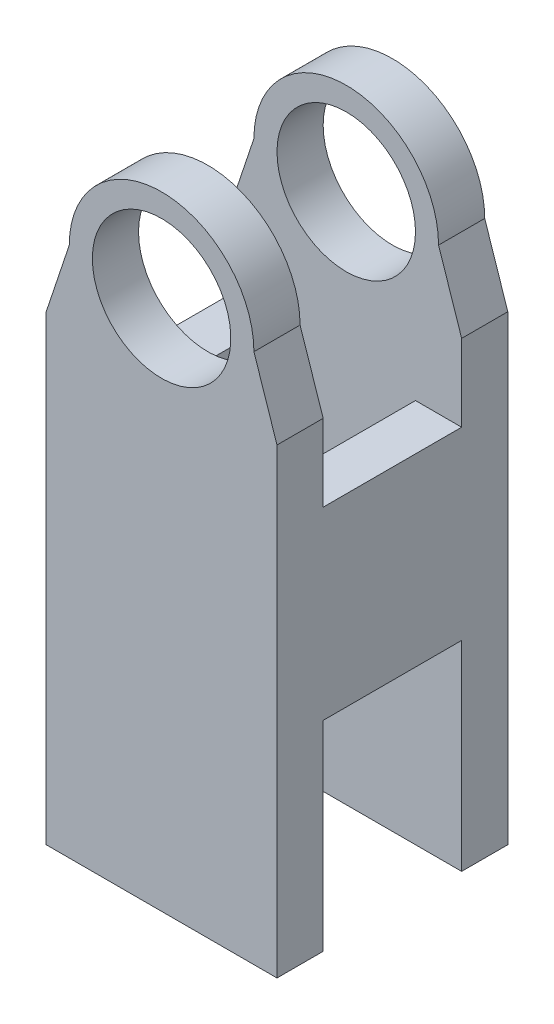
ISO-10303-21;
HEADER;
FILE_DESCRIPTION(('STEP AP214'),'2;1');
FILE_NAME('part.step','',(''),(''),'','','');
FILE_SCHEMA(('AUTOMOTIVE_DESIGN { 1 0 10303 214 1 1 1 1 }'));
ENDSEC;
DATA;
#1=APPLICATION_CONTEXT('core data for automotive mechanical design processes');
#2=APPLICATION_PROTOCOL_DEFINITION('international standard','automotive_design',2000,#1);
#3=PRODUCT_CONTEXT('',#1,'mechanical');
#4=PRODUCT('Part','Part','',(#3));
#5=PRODUCT_RELATED_PRODUCT_CATEGORY('part','',(#4));
#6=PRODUCT_DEFINITION_FORMATION('','',#4);
#7=PRODUCT_DEFINITION_CONTEXT('part definition',#1,'design');
#8=PRODUCT_DEFINITION('design','',#6,#7);
#9=PRODUCT_DEFINITION_SHAPE('','',#8);
#10=(LENGTH_UNIT() NAMED_UNIT(*) SI_UNIT(.MILLI.,.METRE.));
#11=(NAMED_UNIT(*) PLANE_ANGLE_UNIT() SI_UNIT($,.RADIAN.));
#12=(NAMED_UNIT(*) SI_UNIT($,.STERADIAN.) SOLID_ANGLE_UNIT());
#13=UNCERTAINTY_MEASURE_WITH_UNIT(LENGTH_MEASURE(1.E-05),#10,'distance_accuracy_value','');
#14=(GEOMETRIC_REPRESENTATION_CONTEXT(3) GLOBAL_UNCERTAINTY_ASSIGNED_CONTEXT((#13)) GLOBAL_UNIT_ASSIGNED_CONTEXT((#10,
#11,#12)) REPRESENTATION_CONTEXT('',''));
#15=CARTESIAN_POINT('',(0.,0.,0.));
#16=DIRECTION('',(0.,0.,1.));
#17=DIRECTION('',(1.,0.,0.));
#18=AXIS2_PLACEMENT_3D('',#15,#16,#17);
#19=CARTESIAN_POINT('',(7.5,30.,7.5));
#20=DIRECTION('',(-1.,0.,0.));
#21=DIRECTION('',(0.,0.,1.));
#22=AXIS2_PLACEMENT_3D('',#19,#20,#21);
#23=PLANE('',#22);
#24=DIRECTION('',(0.,1.,0.));
#25=VECTOR('',#24,1.);
#26=CARTESIAN_POINT('',(7.5,30.,-4.5));
#27=LINE('',#26,#25);
#28=CARTESIAN_POINT('',(7.5,25.,-4.5));
#29=VERTEX_POINT('',#28);
#30=CARTESIAN_POINT('',(7.5,30.,-4.5));
#31=VERTEX_POINT('',#30);
#32=EDGE_CURVE('E434',#29,#31,#27,.T.);
#33=ORIENTED_EDGE('',*,*,#32,.F.);
#34=DIRECTION('',(0.,0.,-1.));
#35=VECTOR('',#34,1.);
#36=CARTESIAN_POINT('',(7.5,25.,-4.5));
#37=LINE('',#36,#35);
#38=CARTESIAN_POINT('',(7.5,25.,4.5));
#39=VERTEX_POINT('',#38);
#40=EDGE_CURVE('E196',#39,#29,#37,.T.);
#41=ORIENTED_EDGE('',*,*,#40,.F.);
#42=DIRECTION('',(0.,-1.,0.));
#43=VECTOR('',#42,1.);
#44=CARTESIAN_POINT('',(7.5,30.,4.5));
#45=LINE('',#44,#43);
#46=CARTESIAN_POINT('',(7.5,30.,4.5));
#47=VERTEX_POINT('',#46);
#48=EDGE_CURVE('E80',#47,#39,#45,.T.);
#49=ORIENTED_EDGE('',*,*,#48,.F.);
#50=DIRECTION('',(0.,0.,-1.));
#51=VECTOR('',#50,1.);
#52=CARTESIAN_POINT('',(7.5,30.,7.5));
#53=LINE('',#52,#51);
#54=CARTESIAN_POINT('',(7.5,30.,7.5));
#55=VERTEX_POINT('',#54);
#56=EDGE_CURVE('E212',#55,#47,#53,.T.);
#57=ORIENTED_EDGE('',*,*,#56,.F.);
#58=DIRECTION('',(0.,-1.,0.));
#59=VECTOR('',#58,1.);
#60=CARTESIAN_POINT('',(7.5,30.,7.5));
#61=LINE('',#60,#59);
#62=CARTESIAN_POINT('',(7.5,0.,7.5));
#63=VERTEX_POINT('',#62);
#64=EDGE_CURVE('E238',#55,#63,#61,.T.);
#65=ORIENTED_EDGE('',*,*,#64,.T.);
#66=DIRECTION('',(0.,0.,-1.));
#67=VECTOR('',#66,1.);
#68=CARTESIAN_POINT('',(7.5,0.,7.5));
#69=LINE('',#68,#67);
#70=CARTESIAN_POINT('',(7.5,0.,4.5));
#71=VERTEX_POINT('',#70);
#72=EDGE_CURVE('E222',#63,#71,#69,.T.);
#73=ORIENTED_EDGE('',*,*,#72,.T.);
#74=DIRECTION('',(0.,-1.,0.));
#75=VECTOR('',#74,1.);
#76=CARTESIAN_POINT('',(7.5,0.,4.5));
#77=LINE('',#76,#75);
#78=CARTESIAN_POINT('',(7.5,13.,4.5));
#79=VERTEX_POINT('',#78);
#80=EDGE_CURVE('E273',#79,#71,#77,.T.);
#81=ORIENTED_EDGE('',*,*,#80,.F.);
#82=DIRECTION('',(0.,0.,1.));
#83=VECTOR('',#82,1.);
#84=CARTESIAN_POINT('',(7.5,13.,4.5));
#85=LINE('',#84,#83);
#86=CARTESIAN_POINT('',(7.5,13.,-4.5));
#87=VERTEX_POINT('',#86);
#88=EDGE_CURVE('E271',#87,#79,#85,.T.);
#89=ORIENTED_EDGE('',*,*,#88,.F.);
#90=DIRECTION('',(0.,1.,0.));
#91=VECTOR('',#90,1.);
#92=CARTESIAN_POINT('',(7.5,0.,-4.5));
#93=LINE('',#92,#91);
#94=CARTESIAN_POINT('',(7.5,0.,-4.5));
#95=VERTEX_POINT('',#94);
#96=EDGE_CURVE('E268',#95,#87,#93,.T.);
#97=ORIENTED_EDGE('',*,*,#96,.F.);
#98=CARTESIAN_POINT('',(7.5,0.,-7.5));
#99=VERTEX_POINT('',#98);
#100=EDGE_CURVE('E233',#95,#99,#69,.T.);
#101=ORIENTED_EDGE('',*,*,#100,.T.);
#102=DIRECTION('',(0.,-1.,0.));
#103=VECTOR('',#102,1.);
#104=CARTESIAN_POINT('',(7.5,30.,-7.5));
#105=LINE('',#104,#103);
#106=CARTESIAN_POINT('',(7.5,30.,-7.5));
#107=VERTEX_POINT('',#106);
#108=EDGE_CURVE('E240',#107,#99,#105,.T.);
#109=ORIENTED_EDGE('',*,*,#108,.F.);
#110=DIRECTION('',(0.,0.,-1.));
#111=VECTOR('',#110,1.);
#112=CARTESIAN_POINT('',(7.5,30.,14.4010581714358));
#113=LINE('',#112,#111);
#114=EDGE_CURVE('E335',#31,#107,#113,.T.);
#115=ORIENTED_EDGE('',*,*,#114,.F.);
#116=EDGE_LOOP('',(#33,#41,#49,#57,#65,#73,#81,#89,#97,#101,#109,#115));
#117=FACE_BOUND('',#116,.T.);
#118=ADVANCED_FACE('F65',(#117),#23,.F.);
#119=CARTESIAN_POINT('',(4.5,30.,4.5));
#120=DIRECTION('',(-1.,0.,0.));
#121=DIRECTION('',(0.,0.,1.));
#122=AXIS2_PLACEMENT_3D('',#119,#120,#121);
#123=PLANE('',#122);
#124=DIRECTION('',(0.,0.,1.));
#125=VECTOR('',#124,1.);
#126=CARTESIAN_POINT('',(4.5,25.,4.5));
#127=LINE('',#126,#125);
#128=CARTESIAN_POINT('',(4.49999999999999,25.,-4.5));
#129=VERTEX_POINT('',#128);
#130=CARTESIAN_POINT('',(4.49999999999999,25.,4.5));
#131=VERTEX_POINT('',#130);
#132=EDGE_CURVE('E360',#129,#131,#127,.T.);
#133=ORIENTED_EDGE('',*,*,#132,.F.);
#134=DIRECTION('',(0.,-1.,0.));
#135=VECTOR('',#134,1.);
#136=CARTESIAN_POINT('',(4.5,30.,-4.5));
#137=LINE('',#136,#135);
#138=CARTESIAN_POINT('',(4.5,13.,-4.5));
#139=VERTEX_POINT('',#138);
#140=EDGE_CURVE('E344',#129,#139,#137,.T.);
#141=ORIENTED_EDGE('',*,*,#140,.T.);
#142=DIRECTION('',(0.,0.,1.));
#143=VECTOR('',#142,1.);
#144=CARTESIAN_POINT('',(4.5,13.,4.5));
#145=LINE('',#144,#143);
#146=CARTESIAN_POINT('',(4.5,13.,4.5));
#147=VERTEX_POINT('',#146);
#148=EDGE_CURVE('E282',#139,#147,#145,.T.);
#149=ORIENTED_EDGE('',*,*,#148,.T.);
#150=DIRECTION('',(0.,-1.,0.));
#151=VECTOR('',#150,1.);
#152=CARTESIAN_POINT('',(4.5,30.,4.5));
#153=LINE('',#152,#151);
#154=EDGE_CURVE('E221',#131,#147,#153,.T.);
#155=ORIENTED_EDGE('',*,*,#154,.F.);
#156=EDGE_LOOP('',(#133,#141,#149,#155));
#157=FACE_BOUND('',#156,.T.);
#158=ADVANCED_FACE('F357',(#157),#123,.T.);
#159=CARTESIAN_POINT('',(0.,0.,0.));
#160=DIRECTION('',(0.,1.,0.));
#161=DIRECTION('',(0.,0.,1.));
#162=AXIS2_PLACEMENT_3D('',#159,#160,#161);
#163=PLANE('',#162);
#164=DIRECTION('',(1.,0.,0.));
#165=VECTOR('',#164,1.);
#166=CARTESIAN_POINT('',(4.5,0.,4.5));
#167=LINE('',#166,#165);
#168=CARTESIAN_POINT('',(-4.5,0.,4.5));
#169=VERTEX_POINT('',#168);
#170=EDGE_CURVE('E328',#169,#71,#167,.T.);
#171=ORIENTED_EDGE('',*,*,#170,.T.);
#172=ORIENTED_EDGE('',*,*,#72,.F.);
#173=DIRECTION('',(1.,0.,0.));
#174=VECTOR('',#173,1.);
#175=CARTESIAN_POINT('',(7.5,0.,7.5));
#176=LINE('',#175,#174);
#177=CARTESIAN_POINT('',(-7.5,0.,7.5));
#178=VERTEX_POINT('',#177);
#179=EDGE_CURVE('E229',#178,#63,#176,.T.);
#180=ORIENTED_EDGE('',*,*,#179,.F.);
#181=DIRECTION('',(0.,0.,1.));
#182=VECTOR('',#181,1.);
#183=CARTESIAN_POINT('',(-7.5,0.,7.5));
#184=LINE('',#183,#182);
#185=CARTESIAN_POINT('',(-7.5,0.,-7.5));
#186=VERTEX_POINT('',#185);
#187=EDGE_CURVE('E230',#186,#178,#184,.T.);
#188=ORIENTED_EDGE('',*,*,#187,.F.);
#189=DIRECTION('',(-1.,0.,0.));
#190=VECTOR('',#189,1.);
#191=CARTESIAN_POINT('',(7.5,0.,-7.5));
#192=LINE('',#191,#190);
#193=EDGE_CURVE('E214',#99,#186,#192,.T.);
#194=ORIENTED_EDGE('',*,*,#193,.F.);
#195=ORIENTED_EDGE('',*,*,#100,.F.);
#196=DIRECTION('',(-1.,0.,0.));
#197=VECTOR('',#196,1.);
#198=CARTESIAN_POINT('',(4.5,0.,-4.5));
#199=LINE('',#198,#197);
#200=CARTESIAN_POINT('',(-4.5,0.,-4.5));
#201=VERTEX_POINT('',#200);
#202=EDGE_CURVE('E261',#95,#201,#199,.T.);
#203=ORIENTED_EDGE('',*,*,#202,.T.);
#204=DIRECTION('',(0.,0.,1.));
#205=VECTOR('',#204,1.);
#206=CARTESIAN_POINT('',(-4.5,0.,4.5));
#207=LINE('',#206,#205);
#208=EDGE_CURVE('E338',#201,#169,#207,.T.);
#209=ORIENTED_EDGE('',*,*,#208,.T.);
#210=EDGE_LOOP('',(#171,#172,#180,#188,#194,#195,#203,#209));
#211=FACE_BOUND('',#210,.T.);
#212=ADVANCED_FACE('F251',(#211),#163,.F.);
#213=CARTESIAN_POINT('',(-7.5,30.,7.5));
#214=DIRECTION('',(1.,0.,0.));
#215=DIRECTION('',(0.,0.,-1.));
#216=AXIS2_PLACEMENT_3D('',#213,#214,#215);
#217=PLANE('',#216);
#218=DIRECTION('',(0.,0.,-1.));
#219=VECTOR('',#218,1.);
#220=CARTESIAN_POINT('',(-7.5,25.,-4.5));
#221=LINE('',#220,#219);
#222=CARTESIAN_POINT('',(-7.5,25.,4.5));
#223=VERTEX_POINT('',#222);
#224=CARTESIAN_POINT('',(-7.5,25.,-4.5));
#225=VERTEX_POINT('',#224);
#226=EDGE_CURVE('E194',#223,#225,#221,.T.);
#227=ORIENTED_EDGE('',*,*,#226,.T.);
#228=DIRECTION('',(0.,1.,0.));
#229=VECTOR('',#228,1.);
#230=CARTESIAN_POINT('',(-7.5,30.,-4.5));
#231=LINE('',#230,#229);
#232=CARTESIAN_POINT('',(-7.5,30.,-4.5));
#233=VERTEX_POINT('',#232);
#234=EDGE_CURVE('E187',#225,#233,#231,.T.);
#235=ORIENTED_EDGE('',*,*,#234,.T.);
#236=DIRECTION('',(0.,0.,1.));
#237=VECTOR('',#236,1.);
#238=CARTESIAN_POINT('',(-7.5,30.,7.5));
#239=LINE('',#238,#237);
#240=CARTESIAN_POINT('',(-7.5,30.,-7.5));
#241=VERTEX_POINT('',#240);
#242=EDGE_CURVE('E192',#241,#233,#239,.T.);
#243=ORIENTED_EDGE('',*,*,#242,.F.);
#244=DIRECTION('',(0.,-1.,0.));
#245=VECTOR('',#244,1.);
#246=CARTESIAN_POINT('',(-7.5,30.,-7.5));
#247=LINE('',#246,#245);
#248=EDGE_CURVE('E217',#241,#186,#247,.T.);
#249=ORIENTED_EDGE('',*,*,#248,.T.);
#250=ORIENTED_EDGE('',*,*,#187,.T.);
#251=DIRECTION('',(0.,-1.,0.));
#252=VECTOR('',#251,1.);
#253=CARTESIAN_POINT('',(-7.5,30.,7.5));
#254=LINE('',#253,#252);
#255=CARTESIAN_POINT('',(-7.5,30.,7.5));
#256=VERTEX_POINT('',#255);
#257=EDGE_CURVE('E66',#256,#178,#254,.T.);
#258=ORIENTED_EDGE('',*,*,#257,.F.);
#259=DIRECTION('',(0.,0.,1.));
#260=VECTOR('',#259,1.);
#261=CARTESIAN_POINT('',(-7.5,30.,-14.4010581714358));
#262=LINE('',#261,#260);
#263=CARTESIAN_POINT('',(-7.5,30.,4.5));
#264=VERTEX_POINT('',#263);
#265=EDGE_CURVE('E306',#264,#256,#262,.T.);
#266=ORIENTED_EDGE('',*,*,#265,.F.);
#267=DIRECTION('',(0.,-1.,0.));
#268=VECTOR('',#267,1.);
#269=CARTESIAN_POINT('',(-7.5,30.,4.5));
#270=LINE('',#269,#268);
#271=EDGE_CURVE('E197',#264,#223,#270,.T.);
#272=ORIENTED_EDGE('',*,*,#271,.T.);
#273=EDGE_LOOP('',(#227,#235,#243,#249,#250,#258,#266,#272));
#274=FACE_BOUND('',#273,.T.);
#275=ADVANCED_FACE('F63',(#274),#217,.F.);
#276=CARTESIAN_POINT('',(7.5,30.,7.5));
#277=DIRECTION('',(0.,0.,-1.));
#278=DIRECTION('',(-1.,0.,0.));
#279=AXIS2_PLACEMENT_3D('',#276,#277,#278);
#280=PLANE('',#279);
#281=CARTESIAN_POINT('',(0.,34.5,7.5));
#282=DIRECTION('',(0.,0.,-1.));
#283=DIRECTION('',(-1.,0.,0.));
#284=AXIS2_PLACEMENT_3D('',#281,#282,#283);
#285=CIRCLE('',#284,4.5);
#286=CARTESIAN_POINT('',(-4.5,34.5,7.5));
#287=VERTEX_POINT('',#286);
#288=EDGE_CURVE('E297',#287,#287,#285,.T.);
#289=ORIENTED_EDGE('',*,*,#288,.T.);
#290=EDGE_LOOP('',(#289));
#291=FACE_BOUND('',#290,.T.);
#292=ORIENTED_EDGE('',*,*,#257,.T.);
#293=ORIENTED_EDGE('',*,*,#179,.T.);
#294=ORIENTED_EDGE('',*,*,#64,.F.);
#295=DIRECTION('',(0.316227766016838,-0.948683298050514,0.));
#296=VECTOR('',#295,1.);
#297=CARTESIAN_POINT('',(7.5,30.,7.5));
#298=LINE('',#297,#296);
#299=CARTESIAN_POINT('',(6.,34.5,7.5));
#300=VERTEX_POINT('',#299);
#301=EDGE_CURVE('E301',#300,#55,#298,.T.);
#302=ORIENTED_EDGE('',*,*,#301,.F.);
#303=CARTESIAN_POINT('',(0.,34.5,7.5));
#304=DIRECTION('',(0.,0.,-1.));
#305=DIRECTION('',(-1.,0.,0.));
#306=AXIS2_PLACEMENT_3D('',#303,#304,#305);
#307=CIRCLE('',#306,6.);
#308=CARTESIAN_POINT('',(-6.,34.5,7.5));
#309=VERTEX_POINT('',#308);
#310=EDGE_CURVE('E305',#309,#300,#307,.T.);
#311=ORIENTED_EDGE('',*,*,#310,.F.);
#312=DIRECTION('',(0.316227766016838,0.948683298050514,0.));
#313=VECTOR('',#312,1.);
#314=CARTESIAN_POINT('',(-6.,34.5,7.5));
#315=LINE('',#314,#313);
#316=EDGE_CURVE('E248',#256,#309,#315,.T.);
#317=ORIENTED_EDGE('',*,*,#316,.F.);
#318=EDGE_LOOP('',(#292,#293,#294,#302,#311,#317));
#319=FACE_BOUND('',#318,.T.);
#320=ADVANCED_FACE('F243',(#291,#319),#280,.F.);
#321=CARTESIAN_POINT('',(7.5,30.,-7.5));
#322=DIRECTION('',(0.,0.,1.));
#323=DIRECTION('',(1.,0.,0.));
#324=AXIS2_PLACEMENT_3D('',#321,#322,#323);
#325=PLANE('',#324);
#326=CARTESIAN_POINT('',(0.,34.5,-7.5));
#327=DIRECTION('',(0.,0.,-1.));
#328=DIRECTION('',(-1.,0.,0.));
#329=AXIS2_PLACEMENT_3D('',#326,#327,#328);
#330=CIRCLE('',#329,4.5);
#331=CARTESIAN_POINT('',(-4.5,34.5,-7.5));
#332=VERTEX_POINT('',#331);
#333=EDGE_CURVE('E320',#332,#332,#330,.T.);
#334=ORIENTED_EDGE('',*,*,#333,.F.);
#335=EDGE_LOOP('',(#334));
#336=FACE_BOUND('',#335,.T.);
#337=ORIENTED_EDGE('',*,*,#108,.T.);
#338=ORIENTED_EDGE('',*,*,#193,.T.);
#339=ORIENTED_EDGE('',*,*,#248,.F.);
#340=DIRECTION('',(0.316227766016838,0.948683298050514,0.));
#341=VECTOR('',#340,1.);
#342=CARTESIAN_POINT('',(-15.75,5.24999999999999,-7.5));
#343=LINE('',#342,#341);
#344=CARTESIAN_POINT('',(-6.,34.5,-7.5));
#345=VERTEX_POINT('',#344);
#346=EDGE_CURVE('E213',#241,#345,#343,.T.);
#347=ORIENTED_EDGE('',*,*,#346,.T.);
#348=CARTESIAN_POINT('',(0.,34.5,-7.5));
#349=DIRECTION('',(0.,0.,-1.));
#350=DIRECTION('',(-1.,0.,0.));
#351=AXIS2_PLACEMENT_3D('',#348,#349,#350);
#352=CIRCLE('',#351,6.);
#353=CARTESIAN_POINT('',(6.,34.5,-7.5));
#354=VERTEX_POINT('',#353);
#355=EDGE_CURVE('E207',#354,#345,#352,.F.);
#356=ORIENTED_EDGE('',*,*,#355,.F.);
#357=DIRECTION('',(0.316227766016838,-0.948683298050514,0.));
#358=VECTOR('',#357,1.);
#359=CARTESIAN_POINT('',(15.75,5.25,-7.5));
#360=LINE('',#359,#358);
#361=EDGE_CURVE('E319',#354,#107,#360,.T.);
#362=ORIENTED_EDGE('',*,*,#361,.T.);
#363=EDGE_LOOP('',(#337,#338,#339,#347,#356,#362));
#364=FACE_BOUND('',#363,.T.);
#365=ADVANCED_FACE('F258',(#336,#364),#325,.F.);
#366=CARTESIAN_POINT('',(4.5,30.,4.5));
#367=DIRECTION('',(0.,0.,-1.));
#368=DIRECTION('',(-1.,0.,0.));
#369=AXIS2_PLACEMENT_3D('',#366,#367,#368);
#370=PLANE('',#369);
#371=DIRECTION('',(1.,0.,0.));
#372=VECTOR('',#371,1.);
#373=CARTESIAN_POINT('',(-7.5,25.,4.5));
#374=LINE('',#373,#372);
#375=EDGE_CURVE('E352',#131,#39,#374,.T.);
#376=ORIENTED_EDGE('',*,*,#375,.F.);
#377=ORIENTED_EDGE('',*,*,#154,.T.);
#378=DIRECTION('',(1.,0.,0.));
#379=VECTOR('',#378,1.);
#380=CARTESIAN_POINT('',(-7.501,13.,4.5));
#381=LINE('',#380,#379);
#382=EDGE_CURVE('E287',#147,#79,#381,.T.);
#383=ORIENTED_EDGE('',*,*,#382,.T.);
#384=ORIENTED_EDGE('',*,*,#80,.T.);
#385=ORIENTED_EDGE('',*,*,#170,.F.);
#386=DIRECTION('',(0.,-1.,0.));
#387=VECTOR('',#386,1.);
#388=CARTESIAN_POINT('',(-4.5,30.,4.5));
#389=LINE('',#388,#387);
#390=CARTESIAN_POINT('',(-4.5,25.,4.5));
#391=VERTEX_POINT('',#390);
#392=EDGE_CURVE('E342',#391,#169,#389,.T.);
#393=ORIENTED_EDGE('',*,*,#392,.F.);
#394=EDGE_CURVE('E84',#223,#391,#374,.T.);
#395=ORIENTED_EDGE('',*,*,#394,.F.);
#396=ORIENTED_EDGE('',*,*,#271,.F.);
#397=DIRECTION('',(0.316227766016838,0.948683298050514,0.));
#398=VECTOR('',#397,1.);
#399=CARTESIAN_POINT('',(-6.,34.5,4.5));
#400=LINE('',#399,#398);
#401=CARTESIAN_POINT('',(-6.,34.5,4.5));
#402=VERTEX_POINT('',#401);
#403=EDGE_CURVE('E293',#264,#402,#400,.T.);
#404=ORIENTED_EDGE('',*,*,#403,.T.);
#405=CARTESIAN_POINT('',(0.,34.5,4.5));
#406=DIRECTION('',(0.,0.,-1.));
#407=DIRECTION('',(-1.,0.,0.));
#408=AXIS2_PLACEMENT_3D('',#405,#406,#407);
#409=CIRCLE('',#408,6.);
#410=CARTESIAN_POINT('',(6.,34.5,4.5));
#411=VERTEX_POINT('',#410);
#412=EDGE_CURVE('E295',#402,#411,#409,.T.);
#413=ORIENTED_EDGE('',*,*,#412,.T.);
#414=DIRECTION('',(0.316227766016838,-0.948683298050514,0.));
#415=VECTOR('',#414,1.);
#416=CARTESIAN_POINT('',(7.5,30.,4.5));
#417=LINE('',#416,#415);
#418=EDGE_CURVE('E286',#411,#47,#417,.T.);
#419=ORIENTED_EDGE('',*,*,#418,.T.);
#420=ORIENTED_EDGE('',*,*,#48,.T.);
#421=EDGE_LOOP('',(#376,#377,#383,#384,#385,#393,#395,#396,#404,#413,#419,#420));
#422=FACE_BOUND('',#421,.T.);
#423=CARTESIAN_POINT('',(0.,34.5,4.5));
#424=DIRECTION('',(0.,0.,-1.));
#425=DIRECTION('',(-1.,0.,0.));
#426=AXIS2_PLACEMENT_3D('',#423,#424,#425);
#427=CIRCLE('',#426,4.5);
#428=CARTESIAN_POINT('',(-4.5,34.5,4.5));
#429=VERTEX_POINT('',#428);
#430=EDGE_CURVE('E277',#429,#429,#427,.T.);
#431=ORIENTED_EDGE('',*,*,#430,.F.);
#432=EDGE_LOOP('',(#431));
#433=FACE_BOUND('',#432,.T.);
#434=CARTESIAN_POINT('',(0.,11.,4.5));
#435=DIRECTION('',(0.,0.,-1.));
#436=DIRECTION('',(-1.,0.,0.));
#437=AXIS2_PLACEMENT_3D('',#434,#435,#436);
#438=CIRCLE('',#437,2.);
#439=CARTESIAN_POINT('',(-2.,11.,4.5));
#440=VERTEX_POINT('',#439);
#441=EDGE_CURVE('E290',#440,#440,#438,.T.);
#442=ORIENTED_EDGE('',*,*,#441,.F.);
#443=EDGE_LOOP('',(#442));
#444=FACE_BOUND('',#443,.T.);
#445=ADVANCED_FACE('F351',(#422,#433,#444),#370,.T.);
#446=CARTESIAN_POINT('',(4.5,30.,-4.5));
#447=DIRECTION('',(0.,0.,1.));
#448=DIRECTION('',(1.,0.,0.));
#449=AXIS2_PLACEMENT_3D('',#446,#447,#448);
#450=PLANE('',#449);
#451=DIRECTION('',(1.,0.,0.));
#452=VECTOR('',#451,1.);
#453=CARTESIAN_POINT('',(-7.5,25.,-4.5));
#454=LINE('',#453,#452);
#455=CARTESIAN_POINT('',(-4.5,25.,-4.5));
#456=VERTEX_POINT('',#455);
#457=EDGE_CURVE('E439',#225,#456,#454,.T.);
#458=ORIENTED_EDGE('',*,*,#457,.T.);
#459=DIRECTION('',(0.,-1.,0.));
#460=VECTOR('',#459,1.);
#461=CARTESIAN_POINT('',(-4.5,30.,-4.5));
#462=LINE('',#461,#460);
#463=EDGE_CURVE('E343',#456,#201,#462,.T.);
#464=ORIENTED_EDGE('',*,*,#463,.T.);
#465=ORIENTED_EDGE('',*,*,#202,.F.);
#466=ORIENTED_EDGE('',*,*,#96,.T.);
#467=DIRECTION('',(1.,0.,0.));
#468=VECTOR('',#467,1.);
#469=CARTESIAN_POINT('',(-7.501,13.,-4.5));
#470=LINE('',#469,#468);
#471=EDGE_CURVE('E276',#139,#87,#470,.T.);
#472=ORIENTED_EDGE('',*,*,#471,.F.);
#473=ORIENTED_EDGE('',*,*,#140,.F.);
#474=EDGE_CURVE('E445',#129,#29,#454,.T.);
#475=ORIENTED_EDGE('',*,*,#474,.T.);
#476=ORIENTED_EDGE('',*,*,#32,.T.);
#477=DIRECTION('',(0.316227766016838,-0.948683298050514,0.));
#478=VECTOR('',#477,1.);
#479=CARTESIAN_POINT('',(15.75,5.25,-4.5));
#480=LINE('',#479,#478);
#481=CARTESIAN_POINT('',(6.,34.5,-4.5));
#482=VERTEX_POINT('',#481);
#483=EDGE_CURVE('E314',#482,#31,#480,.T.);
#484=ORIENTED_EDGE('',*,*,#483,.F.);
#485=CARTESIAN_POINT('',(0.,34.5,-4.5));
#486=DIRECTION('',(0.,0.,1.));
#487=DIRECTION('',(1.,0.,0.));
#488=AXIS2_PLACEMENT_3D('',#485,#486,#487);
#489=CIRCLE('',#488,6.);
#490=CARTESIAN_POINT('',(-6.,34.5,-4.5));
#491=VERTEX_POINT('',#490);
#492=EDGE_CURVE('E202',#482,#491,#489,.T.);
#493=ORIENTED_EDGE('',*,*,#492,.T.);
#494=DIRECTION('',(0.316227766016838,0.948683298050514,0.));
#495=VECTOR('',#494,1.);
#496=CARTESIAN_POINT('',(-15.75,5.24999999999999,-4.5));
#497=LINE('',#496,#495);
#498=EDGE_CURVE('E203',#233,#491,#497,.T.);
#499=ORIENTED_EDGE('',*,*,#498,.F.);
#500=ORIENTED_EDGE('',*,*,#234,.F.);
#501=EDGE_LOOP('',(#458,#464,#465,#466,#472,#473,#475,#476,#484,#493,#499,#500));
#502=FACE_BOUND('',#501,.T.);
#503=CARTESIAN_POINT('',(0.,11.,-4.5));
#504=DIRECTION('',(0.,0.,1.));
#505=DIRECTION('',(1.,0.,0.));
#506=AXIS2_PLACEMENT_3D('',#503,#504,#505);
#507=CIRCLE('',#506,2.);
#508=CARTESIAN_POINT('',(-2.,11.,-4.5));
#509=VERTEX_POINT('',#508);
#510=EDGE_CURVE('E443',#509,#509,#507,.T.);
#511=ORIENTED_EDGE('',*,*,#510,.F.);
#512=EDGE_LOOP('',(#511));
#513=FACE_BOUND('',#512,.T.);
#514=CARTESIAN_POINT('',(0.,34.5,-4.5));
#515=DIRECTION('',(0.,0.,1.));
#516=DIRECTION('',(1.,0.,0.));
#517=AXIS2_PLACEMENT_3D('',#514,#515,#516);
#518=CIRCLE('',#517,4.5);
#519=CARTESIAN_POINT('',(4.5,34.5,-4.5));
#520=VERTEX_POINT('',#519);
#521=EDGE_CURVE('E326',#520,#520,#518,.F.);
#522=ORIENTED_EDGE('',*,*,#521,.T.);
#523=EDGE_LOOP('',(#522));
#524=FACE_BOUND('',#523,.T.);
#525=ADVANCED_FACE('F205',(#502,#513,#524),#450,.T.);
#526=CARTESIAN_POINT('',(-4.5,30.,4.5));
#527=DIRECTION('',(1.,0.,0.));
#528=DIRECTION('',(0.,0.,-1.));
#529=AXIS2_PLACEMENT_3D('',#526,#527,#528);
#530=PLANE('',#529);
#531=DIRECTION('',(0.,0.,-1.));
#532=VECTOR('',#531,1.);
#533=CARTESIAN_POINT('',(-4.5,25.,4.5));
#534=LINE('',#533,#532);
#535=EDGE_CURVE('E12',#391,#456,#534,.T.);
#536=ORIENTED_EDGE('',*,*,#535,.F.);
#537=ORIENTED_EDGE('',*,*,#392,.T.);
#538=ORIENTED_EDGE('',*,*,#208,.F.);
#539=ORIENTED_EDGE('',*,*,#463,.F.);
#540=EDGE_LOOP('',(#536,#537,#538,#539));
#541=FACE_BOUND('',#540,.T.);
#542=ADVANCED_FACE('F414',(#541),#530,.T.);
#543=CARTESIAN_POINT('',(15.75,5.25,14.4010581714358));
#544=DIRECTION('',(0.948683298050514,0.316227766016838,0.));
#545=DIRECTION('',(-0.316227766016838,0.948683298050514,0.));
#546=AXIS2_PLACEMENT_3D('',#543,#544,#545);
#547=PLANE('',#546);
#548=DIRECTION('',(0.,0.,-1.));
#549=VECTOR('',#548,1.);
#550=CARTESIAN_POINT('',(6.,34.5,14.4010581714358));
#551=LINE('',#550,#549);
#552=EDGE_CURVE('E323',#482,#354,#551,.T.);
#553=ORIENTED_EDGE('',*,*,#552,.F.);
#554=ORIENTED_EDGE('',*,*,#483,.T.);
#555=ORIENTED_EDGE('',*,*,#114,.T.);
#556=ORIENTED_EDGE('',*,*,#361,.F.);
#557=EDGE_LOOP('',(#553,#554,#555,#556));
#558=FACE_BOUND('',#557,.T.);
#559=ADVANCED_FACE('F409',(#558),#547,.T.);
#560=CARTESIAN_POINT('',(0.,34.5,14.4010581714358));
#561=DIRECTION('',(0.,0.,-1.));
#562=DIRECTION('',(-1.,0.,0.));
#563=AXIS2_PLACEMENT_3D('',#560,#561,#562);
#564=CYLINDRICAL_SURFACE('',#563,6.);
#565=ORIENTED_EDGE('',*,*,#492,.F.);
#566=ORIENTED_EDGE('',*,*,#552,.T.);
#567=ORIENTED_EDGE('',*,*,#355,.T.);
#568=DIRECTION('',(0.,0.,-1.));
#569=VECTOR('',#568,1.);
#570=CARTESIAN_POINT('',(-6.,34.5,14.4010581714358));
#571=LINE('',#570,#569);
#572=EDGE_CURVE('E208',#491,#345,#571,.T.);
#573=ORIENTED_EDGE('',*,*,#572,.F.);
#574=EDGE_LOOP('',(#565,#566,#567,#573));
#575=FACE_BOUND('',#574,.T.);
#576=ADVANCED_FACE('F407',(#575),#564,.T.);
#577=CARTESIAN_POINT('',(-15.75,5.24999999999999,14.4010581714358));
#578=DIRECTION('',(-0.948683298050514,0.316227766016838,0.));
#579=DIRECTION('',(-0.316227766016838,-0.948683298050514,0.));
#580=AXIS2_PLACEMENT_3D('',#577,#578,#579);
#581=PLANE('',#580);
#582=ORIENTED_EDGE('',*,*,#242,.T.);
#583=ORIENTED_EDGE('',*,*,#498,.T.);
#584=ORIENTED_EDGE('',*,*,#572,.T.);
#585=ORIENTED_EDGE('',*,*,#346,.F.);
#586=EDGE_LOOP('',(#582,#583,#584,#585));
#587=FACE_BOUND('',#586,.T.);
#588=ADVANCED_FACE('F211',(#587),#581,.T.);
#589=CARTESIAN_POINT('',(0.,34.5,14.4010581714358));
#590=DIRECTION('',(0.,0.,-1.));
#591=DIRECTION('',(-1.,0.,0.));
#592=AXIS2_PLACEMENT_3D('',#589,#590,#591);
#593=CYLINDRICAL_SURFACE('',#592,4.5);
#594=ORIENTED_EDGE('',*,*,#333,.T.);
#595=EDGE_LOOP('',(#594));
#596=FACE_BOUND('',#595,.T.);
#597=ORIENTED_EDGE('',*,*,#521,.F.);
#598=EDGE_LOOP('',(#597));
#599=FACE_BOUND('',#598,.T.);
#600=ADVANCED_FACE('F405',(#596,#599),#593,.F.);
#601=CARTESIAN_POINT('',(7.5,30.,-14.4010581714358));
#602=DIRECTION('',(-0.948683298050514,-0.316227766016838,0.));
#603=DIRECTION('',(0.316227766016838,-0.948683298050514,0.));
#604=AXIS2_PLACEMENT_3D('',#601,#602,#603);
#605=PLANE('',#604);
#606=ORIENTED_EDGE('',*,*,#418,.F.);
#607=DIRECTION('',(0.,0.,1.));
#608=VECTOR('',#607,1.);
#609=CARTESIAN_POINT('',(6.,34.5,-14.4010581714358));
#610=LINE('',#609,#608);
#611=EDGE_CURVE('E309',#411,#300,#610,.T.);
#612=ORIENTED_EDGE('',*,*,#611,.T.);
#613=ORIENTED_EDGE('',*,*,#301,.T.);
#614=ORIENTED_EDGE('',*,*,#56,.T.);
#615=EDGE_LOOP('',(#606,#612,#613,#614));
#616=FACE_BOUND('',#615,.T.);
#617=ADVANCED_FACE('F399',(#616),#605,.F.);
#618=CARTESIAN_POINT('',(0.,34.5,-14.4010581714358));
#619=DIRECTION('',(0.,0.,1.));
#620=DIRECTION('',(1.,0.,0.));
#621=AXIS2_PLACEMENT_3D('',#618,#619,#620);
#622=CYLINDRICAL_SURFACE('',#621,6.);
#623=ORIENTED_EDGE('',*,*,#412,.F.);
#624=DIRECTION('',(0.,0.,1.));
#625=VECTOR('',#624,1.);
#626=CARTESIAN_POINT('',(-6.,34.5,-14.4010581714358));
#627=LINE('',#626,#625);
#628=EDGE_CURVE('E315',#402,#309,#627,.T.);
#629=ORIENTED_EDGE('',*,*,#628,.T.);
#630=ORIENTED_EDGE('',*,*,#310,.T.);
#631=ORIENTED_EDGE('',*,*,#611,.F.);
#632=EDGE_LOOP('',(#623,#629,#630,#631));
#633=FACE_BOUND('',#632,.T.);
#634=ADVANCED_FACE('F393',(#633),#622,.T.);
#635=CARTESIAN_POINT('',(-6.,34.5,-14.4010581714358));
#636=DIRECTION('',(0.948683298050514,-0.316227766016838,0.));
#637=DIRECTION('',(0.316227766016838,0.948683298050514,0.));
#638=AXIS2_PLACEMENT_3D('',#635,#636,#637);
#639=PLANE('',#638);
#640=ORIENTED_EDGE('',*,*,#403,.F.);
#641=ORIENTED_EDGE('',*,*,#265,.T.);
#642=ORIENTED_EDGE('',*,*,#316,.T.);
#643=ORIENTED_EDGE('',*,*,#628,.F.);
#644=EDGE_LOOP('',(#640,#641,#642,#643));
#645=FACE_BOUND('',#644,.T.);
#646=ADVANCED_FACE('F383',(#645),#639,.F.);
#647=CARTESIAN_POINT('',(0.,34.5,-14.4010581714358));
#648=DIRECTION('',(0.,0.,1.));
#649=DIRECTION('',(1.,0.,0.));
#650=AXIS2_PLACEMENT_3D('',#647,#648,#649);
#651=CYLINDRICAL_SURFACE('',#650,4.5);
#652=ORIENTED_EDGE('',*,*,#430,.T.);
#653=EDGE_LOOP('',(#652));
#654=FACE_BOUND('',#653,.T.);
#655=ORIENTED_EDGE('',*,*,#288,.F.);
#656=EDGE_LOOP('',(#655));
#657=FACE_BOUND('',#656,.T.);
#658=ADVANCED_FACE('F385',(#654,#657),#651,.F.);
#659=CARTESIAN_POINT('',(-7.501,13.,4.5));
#660=DIRECTION('',(0.,1.,0.));
#661=DIRECTION('',(0.,0.,1.));
#662=AXIS2_PLACEMENT_3D('',#659,#660,#661);
#663=PLANE('',#662);
#664=ORIENTED_EDGE('',*,*,#471,.T.);
#665=ORIENTED_EDGE('',*,*,#88,.T.);
#666=ORIENTED_EDGE('',*,*,#382,.F.);
#667=ORIENTED_EDGE('',*,*,#148,.F.);
#668=EDGE_LOOP('',(#664,#665,#666,#667));
#669=FACE_BOUND('',#668,.T.);
#670=ADVANCED_FACE('F354',(#669),#663,.F.);
#671=CARTESIAN_POINT('',(0.,11.,10.1568542494924));
#672=DIRECTION('',(0.,0.,-1.));
#673=DIRECTION('',(-1.,0.,0.));
#674=AXIS2_PLACEMENT_3D('',#671,#672,#673);
#675=CYLINDRICAL_SURFACE('',#674,2.);
#676=CARTESIAN_POINT('',(-2.,11.,4.5));
#677=CARTESIAN_POINT('',(-2.,11.,4.40625));
#678=CARTESIAN_POINT('',(-2.,11.,4.3125));
#679=CARTESIAN_POINT('',(-2.,11.,4.125));
#680=CARTESIAN_POINT('',(-2.,11.,4.03125));
#681=CARTESIAN_POINT('',(-2.,11.,3.84375));
#682=CARTESIAN_POINT('',(-2.,11.,3.75));
#683=CARTESIAN_POINT('',(-2.,11.,3.5625));
#684=CARTESIAN_POINT('',(-2.,11.,3.46875));
#685=CARTESIAN_POINT('',(-2.,11.,3.28125));
#686=CARTESIAN_POINT('',(-2.,11.,3.1875));
#687=CARTESIAN_POINT('',(-2.,11.,3.));
#688=CARTESIAN_POINT('',(-2.,11.,2.90625));
#689=CARTESIAN_POINT('',(-2.,11.,2.71875));
#690=CARTESIAN_POINT('',(-2.,11.,2.625));
#691=CARTESIAN_POINT('',(-2.,11.,2.4375));
#692=CARTESIAN_POINT('',(-2.,11.,2.34375));
#693=CARTESIAN_POINT('',(-2.,11.,2.15625));
#694=CARTESIAN_POINT('',(-2.,11.,2.0625));
#695=CARTESIAN_POINT('',(-2.,11.,1.875));
#696=CARTESIAN_POINT('',(-2.,11.,1.78125));
#697=CARTESIAN_POINT('',(-2.,11.,1.59375));
#698=CARTESIAN_POINT('',(-2.,11.,1.5));
#699=CARTESIAN_POINT('',(-2.,11.,1.3125));
#700=CARTESIAN_POINT('',(-2.,11.,1.21875));
#701=CARTESIAN_POINT('',(-2.,11.,1.03125));
#702=CARTESIAN_POINT('',(-2.,11.,0.937500000000001));
#703=CARTESIAN_POINT('',(-2.,11.,0.750000000000001));
#704=CARTESIAN_POINT('',(-2.,11.,0.656250000000001));
#705=CARTESIAN_POINT('',(-2.,11.,0.46875));
#706=CARTESIAN_POINT('',(-2.,11.,0.375));
#707=CARTESIAN_POINT('',(-2.,11.,0.1875));
#708=CARTESIAN_POINT('',(-2.,11.,0.0937500000000001));
#709=CARTESIAN_POINT('',(-2.,11.,-0.0937500000000001));
#710=CARTESIAN_POINT('',(-2.,11.,-0.1875));
#711=CARTESIAN_POINT('',(-2.,11.,-0.375));
#712=CARTESIAN_POINT('',(-2.,11.,-0.46875));
#713=CARTESIAN_POINT('',(-2.,11.,-0.656250000000001));
#714=CARTESIAN_POINT('',(-2.,11.,-0.750000000000001));
#715=CARTESIAN_POINT('',(-2.,11.,-0.937500000000001));
#716=CARTESIAN_POINT('',(-2.,11.,-1.03125));
#717=CARTESIAN_POINT('',(-2.,11.,-1.21875));
#718=CARTESIAN_POINT('',(-2.,11.,-1.3125));
#719=CARTESIAN_POINT('',(-2.,11.,-1.5));
#720=CARTESIAN_POINT('',(-2.,11.,-1.59375));
#721=CARTESIAN_POINT('',(-2.,11.,-1.78125));
#722=CARTESIAN_POINT('',(-2.,11.,-1.875));
#723=CARTESIAN_POINT('',(-2.,11.,-2.0625));
#724=CARTESIAN_POINT('',(-2.,11.,-2.15625));
#725=CARTESIAN_POINT('',(-2.,11.,-2.34375));
#726=CARTESIAN_POINT('',(-2.,11.,-2.4375));
#727=CARTESIAN_POINT('',(-2.,11.,-2.625));
#728=CARTESIAN_POINT('',(-2.,11.,-2.71875));
#729=CARTESIAN_POINT('',(-2.,11.,-2.90625));
#730=CARTESIAN_POINT('',(-2.,11.,-3.));
#731=CARTESIAN_POINT('',(-2.,11.,-3.1875));
#732=CARTESIAN_POINT('',(-2.,11.,-3.28125));
#733=CARTESIAN_POINT('',(-2.,11.,-3.46875));
#734=CARTESIAN_POINT('',(-2.,11.,-3.5625));
#735=CARTESIAN_POINT('',(-2.,11.,-3.75));
#736=CARTESIAN_POINT('',(-2.,11.,-3.84375));
#737=CARTESIAN_POINT('',(-2.,11.,-4.03125));
#738=CARTESIAN_POINT('',(-2.,11.,-4.125));
#739=CARTESIAN_POINT('',(-2.,11.,-4.3125));
#740=CARTESIAN_POINT('',(-2.,11.,-4.40625));
#741=CARTESIAN_POINT('',(-2.,11.,-4.5));
#742=B_SPLINE_CURVE_WITH_KNOTS('',3,(#676,#677,#678,#679,#680,#681,#682,#683,#684,#685,#686,
#687,#688,#689,#690,#691,#692,#693,#694,#695,#696,#697,#698,#699,#700,#701,#702,#703,#704,#705,
#706,#707,#708,#709,#710,#711,#712,#713,#714,#715,#716,#717,#718,#719,#720,#721,#722,#723,#724,
#725,#726,#727,#728,#729,#730,#731,#732,#733,#734,#735,#736,#737,#738,#739,#740,#741),
.UNSPECIFIED.,.F.,.F.,(4,2,2,2,2,2,2,2,2,2,2,2,2,2,2,2,2,2,2,2,2,2,2,2,2,2,2,2,2,2,2,2,4),(0.,
0.28125,0.5625,0.84375,1.125,1.40625,1.6875,1.96875,2.25,2.53125,2.8125,3.09375,3.375,3.65625,
3.9375,4.21875,4.5,4.78125,5.0625,5.34375,5.625,5.90625,6.1875,6.46875,6.75,7.03125,7.3125,
7.59375,7.875,8.15625,8.4375,8.71875,9.),.UNSPECIFIED.);
#743=EDGE_CURVE('BSEAM395',#440,#509,#742,.T.);
#744=ORIENTED_EDGE('',*,*,#441,.T.);
#745=ORIENTED_EDGE('',*,*,#510,.T.);
#746=ORIENTED_EDGE('',*,*,#743,.T.);
#747=ORIENTED_EDGE('',*,*,#743,.F.);
#748=EDGE_LOOP('',(#744,#746,#745,#747));
#749=FACE_BOUND('',#748,.T.);
#750=ADVANCED_FACE('F395',(#749),#675,.T.);
#751=CARTESIAN_POINT('',(-7.5,25.,-4.5));
#752=DIRECTION('',(0.,-1.,0.));
#753=DIRECTION('',(0.,0.,-1.));
#754=AXIS2_PLACEMENT_3D('',#751,#752,#753);
#755=PLANE('',#754);
#756=ORIENTED_EDGE('',*,*,#535,.T.);
#757=ORIENTED_EDGE('',*,*,#457,.F.);
#758=ORIENTED_EDGE('',*,*,#226,.F.);
#759=ORIENTED_EDGE('',*,*,#394,.T.);
#760=EDGE_LOOP('',(#756,#757,#758,#759));
#761=FACE_BOUND('',#760,.T.);
#762=ADVANCED_FACE('F453',(#761),#755,.F.);
#763=ORIENTED_EDGE('',*,*,#132,.T.);
#764=ORIENTED_EDGE('',*,*,#375,.T.);
#765=ORIENTED_EDGE('',*,*,#40,.T.);
#766=ORIENTED_EDGE('',*,*,#474,.F.);
#767=EDGE_LOOP('',(#763,#764,#765,#766));
#768=FACE_BOUND('',#767,.T.);
#769=ADVANCED_FACE('F458',(#768),#755,.F.);
#770=CLOSED_SHELL('',(#118,#158,#212,#275,#320,#365,#445,#525,#542,#559,#576,#588,#600,#617,
#634,#646,#658,#670,#750,#762,#769));
#771=MANIFOLD_SOLID_BREP('B2',#770);
#772=ADVANCED_BREP_SHAPE_REPRESENTATION('',(#18,#771),#14);
#773=SHAPE_DEFINITION_REPRESENTATION(#9,#772);
ENDSEC;
END-ISO-10303-21;
